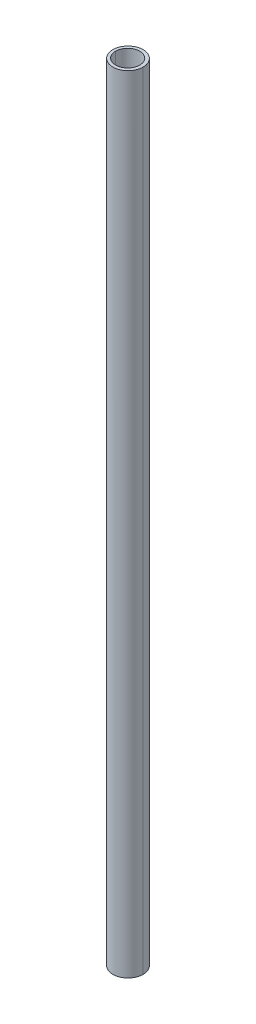
ISO-10303-21;
HEADER;
FILE_DESCRIPTION(('STEP AP214'),'2;1');
FILE_NAME('part.step','',(''),(''),'','','');
FILE_SCHEMA(('AUTOMOTIVE_DESIGN { 1 0 10303 214 1 1 1 1 }'));
ENDSEC;
DATA;
#1=APPLICATION_CONTEXT('core data for automotive mechanical design processes');
#2=APPLICATION_PROTOCOL_DEFINITION('international standard','automotive_design',2000,#1);
#3=PRODUCT_CONTEXT('',#1,'mechanical');
#4=PRODUCT('Part','Part','',(#3));
#5=PRODUCT_RELATED_PRODUCT_CATEGORY('part','',(#4));
#6=PRODUCT_DEFINITION_FORMATION('','',#4);
#7=PRODUCT_DEFINITION_CONTEXT('part definition',#1,'design');
#8=PRODUCT_DEFINITION('design','',#6,#7);
#9=PRODUCT_DEFINITION_SHAPE('','',#8);
#10=(LENGTH_UNIT() NAMED_UNIT(*) SI_UNIT(.MILLI.,.METRE.));
#11=(NAMED_UNIT(*) PLANE_ANGLE_UNIT() SI_UNIT($,.RADIAN.));
#12=(NAMED_UNIT(*) SI_UNIT($,.STERADIAN.) SOLID_ANGLE_UNIT());
#13=UNCERTAINTY_MEASURE_WITH_UNIT(LENGTH_MEASURE(1.E-05),#10,'distance_accuracy_value','');
#14=(GEOMETRIC_REPRESENTATION_CONTEXT(3) GLOBAL_UNCERTAINTY_ASSIGNED_CONTEXT((#13)) GLOBAL_UNIT_ASSIGNED_CONTEXT((#10,
#11,#12)) REPRESENTATION_CONTEXT('',''));
#15=CARTESIAN_POINT('',(0.,0.,0.));
#16=DIRECTION('',(0.,0.,1.));
#17=DIRECTION('',(1.,0.,0.));
#18=AXIS2_PLACEMENT_3D('',#15,#16,#17);
#19=CARTESIAN_POINT('',(-0.011653013068616,-130.,-0.011565059006402));
#20=DIRECTION('',(0.,1.,0.));
#21=DIRECTION('',(-1.,0.,0.));
#22=AXIS2_PLACEMENT_3D('',#19,#20,#21);
#23=PLANE('',#22);
#24=CARTESIAN_POINT('',(-0.011653013068616,-130.,-0.0115650590064179));
#25=DIRECTION('',(0.,1.,0.));
#26=DIRECTION('',(1.,0.,0.));
#27=AXIS2_PLACEMENT_3D('',#24,#25,#26);
#28=CIRCLE('',#27,5.);
#29=CARTESIAN_POINT('',(4.98834698693138,-130.,-0.0115650590064184));
#30=VERTEX_POINT('',#29);
#31=CARTESIAN_POINT('',(-5.01165301306862,-130.,-0.011565059006407));
#32=VERTEX_POINT('',#31);
#33=EDGE_CURVE('E64',#30,#32,#28,.T.);
#34=ORIENTED_EDGE('',*,*,#33,.F.);
#35=CARTESIAN_POINT('',(-0.011653013068616,-130.,-0.0115650590064179));
#36=DIRECTION('',(0.,1.,0.));
#37=DIRECTION('',(-1.,0.,0.));
#38=AXIS2_PLACEMENT_3D('',#35,#36,#37);
#39=CIRCLE('',#38,5.);
#40=EDGE_CURVE('E58',#32,#30,#39,.T.);
#41=ORIENTED_EDGE('',*,*,#40,.F.);
#42=EDGE_LOOP('',(#34,#41));
#43=FACE_BOUND('',#42,.T.);
#44=CARTESIAN_POINT('',(-0.122584693569405,-130.,-0.0115650590064179));
#45=DIRECTION('',(0.,-1.,0.));
#46=DIRECTION('',(1.,0.,0.));
#47=AXIS2_PLACEMENT_3D('',#44,#45,#46);
#48=CIRCLE('',#47,4.);
#49=CARTESIAN_POINT('',(3.8774153064306,-130.,-0.0115650590064181));
#50=VERTEX_POINT('',#49);
#51=CARTESIAN_POINT('',(-4.12258469356941,-130.,-0.011565059006407));
#52=VERTEX_POINT('',#51);
#53=EDGE_CURVE('E129',#50,#52,#48,.T.);
#54=ORIENTED_EDGE('',*,*,#53,.F.);
#55=CARTESIAN_POINT('',(-0.122584693569405,-130.,-0.0115650590064179));
#56=DIRECTION('',(0.,-1.,0.));
#57=DIRECTION('',(-1.,0.,0.));
#58=AXIS2_PLACEMENT_3D('',#55,#56,#57);
#59=CIRCLE('',#58,4.);
#60=EDGE_CURVE('E88',#52,#50,#59,.T.);
#61=ORIENTED_EDGE('',*,*,#60,.F.);
#62=EDGE_LOOP('',(#54,#61));
#63=FACE_BOUND('',#62,.T.);
#64=ADVANCED_FACE('F18',(#43,#63),#23,.F.);
#65=CARTESIAN_POINT('',(-0.011653013068616,130.,-0.011565059006402));
#66=DIRECTION('',(0.,-1.,0.));
#67=DIRECTION('',(1.,0.,0.));
#68=AXIS2_PLACEMENT_3D('',#65,#66,#67);
#69=CYLINDRICAL_SURFACE('',#68,5.);
#70=CARTESIAN_POINT('',(4.98834698693138,130.,-0.011565059006381));
#71=DIRECTION('',(0.,-1.,0.));
#72=VECTOR('',#71,1.);
#73=LINE('',#70,#72);
#74=CARTESIAN_POINT('',(4.98834698693138,130.,-0.0115650590064022));
#75=VERTEX_POINT('',#74);
#76=EDGE_CURVE('E81',#75,#30,#73,.T.);
#77=ORIENTED_EDGE('',*,*,#76,.F.);
#78=CARTESIAN_POINT('',(-5.01165301306862,130.,-0.011565059006402));
#79=CARTESIAN_POINT('',(-5.01165301306862,130.,0.480614136488761));
#80=CARTESIAN_POINT('',(-4.91557941508477,130.,0.963886551074239));
#81=CARTESIAN_POINT('',(-4.81966618800687,130.,1.44635226291753));
#82=CARTESIAN_POINT('',(-4.63105067562505,130.,1.90185210281905));
#83=CARTESIAN_POINT('',(-4.44285600322633,130.,2.35633562893756));
#84=CARTESIAN_POINT('',(-4.16900107458134,130.,2.76628610609161));
#85=CARTESIAN_POINT('',(-3.8957571725812,130.,3.17532189945361));
#86=CARTESIAN_POINT('',(-3.54718691900136,130.,3.52396884692634));
#87=CARTESIAN_POINT('',(-3.19939439731767,130.,3.87183789138307));
#88=CARTESIAN_POINT('',(-2.78950417816663,130.,4.14578300250632));
#89=CARTESIAN_POINT('',(-2.38052850836105,130.,4.41911688576816));
#90=CARTESIAN_POINT('',(-1.92507017489407,130.,4.60783260355003));
#91=CARTESIAN_POINT('',(-1.47062806260246,130.,4.79612725776924));
#92=CARTESIAN_POINT('',(-0.987104623149258,130.,4.89236134300975));
#93=CARTESIAN_POINT('',(-0.504660023891753,130.,4.98838071022238));
#94=CARTESIAN_POINT('',(-0.011653013068616,130.,4.9884349409936));
#95=CARTESIAN_POINT('',(0.480253997764685,130.,4.98848905076482));
#96=CARTESIAN_POINT('',(0.963798597012025,130.,4.89236134300975));
#97=CARTESIAN_POINT('',(1.44626430885683,130.,4.79644811593153));
#98=CARTESIAN_POINT('',(1.90176414875683,130.,4.60783260355003));
#99=CARTESIAN_POINT('',(2.35624767487655,130.,4.4196379311505));
#100=CARTESIAN_POINT('',(2.76619815202939,130.,4.14578300250632));
#101=CARTESIAN_POINT('',(3.17523394539255,130.,3.8725391005054));
#102=CARTESIAN_POINT('',(3.52388089286412,130.,3.52396884692634));
#103=CARTESIAN_POINT('',(3.87174993732204,130.,3.17617632524107));
#104=CARTESIAN_POINT('',(4.14569504844411,130.,2.76628610609161));
#105=CARTESIAN_POINT('',(4.41902893170564,130.,2.35731043628629));
#106=CARTESIAN_POINT('',(4.60774464948781,130.,1.90185210281905));
#107=CARTESIAN_POINT('',(4.79603930370664,130.,1.44740999052883));
#108=CARTESIAN_POINT('',(4.89227338894753,130.,0.963886551074241));
#109=CARTESIAN_POINT('',(4.98834698693138,130.,0.481169471968165));
#110=CARTESIAN_POINT('',(4.98834698693138,130.,-0.0115650590064014));
#111=B_SPLINE_CURVE_WITH_KNOTS('',2,(#78,#79,#80,#81,#82,#83,#84,#85,#86,#87,#88,#89,#90,#91,
#92,#93,#94,#95,#96,#97,#98,#99,#100,#101,#102,#103,#104,#105,#106,#107,#108,#109,#110),
.UNSPECIFIED.,.F.,.F.,(3,2,2,2,2,2,2,2,2,2,2,2,2,2,2,2,3),(0.,0.0625,0.125,0.1875,0.25,0.3125,
0.375,0.4375,0.5,0.5625,0.625,0.6875,0.75,0.8125,0.875,0.9375,1.),.UNSPECIFIED.);
#112=CARTESIAN_POINT('',(-5.01165301306862,130.,-0.0115650590064016));
#113=VERTEX_POINT('',#112);
#114=EDGE_CURVE('E74',#113,#75,#111,.T.);
#115=ORIENTED_EDGE('',*,*,#114,.F.);
#116=CARTESIAN_POINT('',(-5.01165301306862,-130.,-0.0115650590064284));
#117=DIRECTION('',(0.,1.,0.));
#118=VECTOR('',#117,1.);
#119=LINE('',#116,#118);
#120=EDGE_CURVE('E68',#32,#113,#119,.T.);
#121=ORIENTED_EDGE('',*,*,#120,.F.);
#122=ORIENTED_EDGE('',*,*,#40,.T.);
#123=EDGE_LOOP('',(#77,#115,#121,#122));
#124=FACE_BOUND('',#123,.T.);
#125=ADVANCED_FACE('F72',(#124),#69,.T.);
#126=CARTESIAN_POINT('',(-0.011653013068616,130.,-0.011565059006402));
#127=DIRECTION('',(0.,-1.,0.));
#128=DIRECTION('',(1.,0.,0.));
#129=AXIS2_PLACEMENT_3D('',#126,#127,#128);
#130=CYLINDRICAL_SURFACE('',#129,5.);
#131=ORIENTED_EDGE('',*,*,#76,.T.);
#132=ORIENTED_EDGE('',*,*,#33,.T.);
#133=ORIENTED_EDGE('',*,*,#120,.T.);
#134=CARTESIAN_POINT('',(4.98834698693138,130.,-0.0115650590064014));
#135=CARTESIAN_POINT('',(4.98834698693138,130.,-0.50374425450012));
#136=CARTESIAN_POINT('',(4.89227338894753,130.,-0.987016669087044));
#137=CARTESIAN_POINT('',(4.79636016187004,130.,-1.46948238092974));
#138=CARTESIAN_POINT('',(4.60774464948781,130.,-1.92498222083185));
#139=CARTESIAN_POINT('',(4.41954997708846,130.,-2.37946574695149));
#140=CARTESIAN_POINT('',(4.14569504844411,130.,-2.78941622410441));
#141=CARTESIAN_POINT('',(3.8724511464428,130.,-3.19845201746796));
#142=CARTESIAN_POINT('',(3.52388089286412,130.,-3.54709896493914));
#143=CARTESIAN_POINT('',(3.17608837117847,130.,-3.89496800939745));
#144=CARTESIAN_POINT('',(2.76619815202939,130.,-4.16891312051913));
#145=CARTESIAN_POINT('',(2.35722248222187,130.,-4.442247003782));
#146=CARTESIAN_POINT('',(1.90176414875683,130.,-4.63096272156283));
#147=CARTESIAN_POINT('',(1.44732203646283,130.,-4.8192573757828));
#148=CARTESIAN_POINT('',(0.963798597012027,130.,-4.91549146102255));
#149=CARTESIAN_POINT('',(0.481353997753079,130.,-5.01151082823518));
#150=CARTESIAN_POINT('',(-0.0116530130686151,130.,-5.0115650590064));
#151=CARTESIAN_POINT('',(-0.503560023900487,130.,-5.01161916877762));
#152=CARTESIAN_POINT('',(-0.987104623149258,130.,-4.91549146102255));
#153=CARTESIAN_POINT('',(-1.46957033499205,130.,-4.81957823394502));
#154=CARTESIAN_POINT('',(-1.92507017489407,130.,-4.63096272156283));
#155=CARTESIAN_POINT('',(-2.37955370101473,130.,-4.44276804916306));
#156=CARTESIAN_POINT('',(-2.78950417816663,130.,-4.16891312051913));
#157=CARTESIAN_POINT('',(-3.19853997153155,130.,-3.89566921851665));
#158=CARTESIAN_POINT('',(-3.54718691900135,130.,-3.54709896493914));
#159=CARTESIAN_POINT('',(-3.89505596346006,130.,-3.1993064432529));
#160=CARTESIAN_POINT('',(-4.16900107458134,130.,-2.78941622410441));
#161=CARTESIAN_POINT('',(-4.44233495784421,130.,-2.38044055429689));
#162=CARTESIAN_POINT('',(-4.63105067562505,130.,-1.92498222083185));
#163=CARTESIAN_POINT('',(-4.81934532984502,130.,-1.47054010853784));
#164=CARTESIAN_POINT('',(-4.91557941508477,130.,-0.987016669087046));
#165=CARTESIAN_POINT('',(-5.01165301306862,130.,-0.504299589979015));
#166=CARTESIAN_POINT('',(-5.01165301306862,130.,-0.011565059006402));
#167=B_SPLINE_CURVE_WITH_KNOTS('',2,(#134,#135,#136,#137,#138,#139,#140,#141,#142,#143,#144,
#145,#146,#147,#148,#149,#150,#151,#152,#153,#154,#155,#156,#157,#158,#159,#160,#161,#162,#163,
#164,#165,#166),.UNSPECIFIED.,.F.,.F.,(3,2,2,2,2,2,2,2,2,2,2,2,2,2,2,2,3),(0.,0.0625,0.125,
0.1875,0.25,0.3125,0.375,0.4375,0.5,0.5625,0.625,0.6875,0.75,0.8125,0.875,0.9375,1.),.UNSPECIFIED.);
#168=EDGE_CURVE('E122',#75,#113,#167,.T.);
#169=ORIENTED_EDGE('',*,*,#168,.F.);
#170=EDGE_LOOP('',(#131,#132,#133,#169));
#171=FACE_BOUND('',#170,.T.);
#172=ADVANCED_FACE('F85',(#171),#130,.T.);
#173=CARTESIAN_POINT('',(-0.122584693569405,130.,-0.011565059006402));
#174=DIRECTION('',(0.,-1.,0.));
#175=DIRECTION('',(1.,0.,0.));
#176=AXIS2_PLACEMENT_3D('',#173,#174,#175);
#177=CYLINDRICAL_SURFACE('',#176,4.);
#178=CARTESIAN_POINT('',(3.8774153064306,130.,-0.0115650590063852));
#179=DIRECTION('',(0.,-1.,0.));
#180=VECTOR('',#179,1.);
#181=LINE('',#178,#180);
#182=CARTESIAN_POINT('',(3.8774153064306,130.,-0.0115650590064025));
#183=VERTEX_POINT('',#182);
#184=EDGE_CURVE('E38',#183,#50,#181,.T.);
#185=ORIENTED_EDGE('',*,*,#184,.F.);
#186=CARTESIAN_POINT('',(-4.12258469356941,130.,-0.011565059006402));
#187=CARTESIAN_POINT('',(-4.12258469356941,130.,-0.806928552906533));
#188=CARTESIAN_POINT('',(-3.81810282361455,130.,-1.54229878846676));
#189=CARTESIAN_POINT('',(-3.5139324395182,130.,-2.27691673808901));
#190=CARTESIAN_POINT('',(-2.9510118183156,130.,-2.83999218375259));
#191=CARTESIAN_POINT('',(-2.3888689076145,130.,-3.40228970501487));
#192=CARTESIAN_POINT('',(-1.65331842302977,130.,-3.70708318905155));
#193=CARTESIAN_POINT('',(-0.918784148038959,130.,-4.01145558158039));
#194=CARTESIAN_POINT('',(-0.122584693569405,130.,-4.0115650590064));
#195=CARTESIAN_POINT('',(0.672514760912545,130.,-4.01167438518241));
#196=CARTESIAN_POINT('',(1.40814903589095,130.,-3.70708318905155));
#197=CARTESIAN_POINT('',(2.14276698551485,130.,-3.40291280495449));
#198=CARTESIAN_POINT('',(2.70584243117678,130.,-2.83999218375259));
#199=CARTESIAN_POINT('',(3.26813995243972,130.,-2.27784927304989));
#200=CARTESIAN_POINT('',(3.57293343647574,130.,-1.54229878846676));
#201=CARTESIAN_POINT('',(3.87741530643059,130.,-0.807500314344509));
#202=CARTESIAN_POINT('',(3.87741530643059,130.,-0.0115650590064025));
#203=B_SPLINE_CURVE_WITH_KNOTS('',2,(#186,#187,#188,#189,#190,#191,#192,#193,#194,#195,#196,
#197,#198,#199,#200,#201,#202),.UNSPECIFIED.,.F.,.F.,(3,2,2,2,2,2,2,2,3),(0.,0.125,0.25,0.375,
0.5,0.625,0.75,0.875,1.),.UNSPECIFIED.);
#204=CARTESIAN_POINT('',(-4.12258469356941,130.,-0.0115650590064017));
#205=VERTEX_POINT('',#204);
#206=EDGE_CURVE('E30',#205,#183,#203,.T.);
#207=ORIENTED_EDGE('',*,*,#206,.F.);
#208=CARTESIAN_POINT('',(-4.12258469356941,-130.,-0.0115650590064263));
#209=DIRECTION('',(0.,1.,0.));
#210=VECTOR('',#209,1.);
#211=LINE('',#208,#210);
#212=EDGE_CURVE('E175',#52,#205,#211,.T.);
#213=ORIENTED_EDGE('',*,*,#212,.F.);
#214=ORIENTED_EDGE('',*,*,#60,.T.);
#215=EDGE_LOOP('',(#185,#207,#213,#214));
#216=FACE_BOUND('',#215,.T.);
#217=ADVANCED_FACE('F103',(#216),#177,.F.);
#218=CARTESIAN_POINT('',(-0.122584693569405,130.,-0.011565059006402));
#219=DIRECTION('',(0.,-1.,0.));
#220=DIRECTION('',(1.,0.,0.));
#221=AXIS2_PLACEMENT_3D('',#218,#219,#220);
#222=CYLINDRICAL_SURFACE('',#221,4.);
#223=ORIENTED_EDGE('',*,*,#184,.T.);
#224=ORIENTED_EDGE('',*,*,#53,.T.);
#225=ORIENTED_EDGE('',*,*,#212,.T.);
#226=CARTESIAN_POINT('',(3.87741530643059,130.,-0.0115650590064025));
#227=CARTESIAN_POINT('',(3.87741530643059,130.,0.783798434893784));
#228=CARTESIAN_POINT('',(3.57293343647574,130.,1.51916867045396));
#229=CARTESIAN_POINT('',(3.26876305237913,130.,2.25378662007678));
#230=CARTESIAN_POINT('',(2.70584243117678,130.,2.81686206573979));
#231=CARTESIAN_POINT('',(2.14369952047516,130.,3.37915958700228));
#232=CARTESIAN_POINT('',(1.40814903589096,130.,3.68395307103874));
#233=CARTESIAN_POINT('',(0.673614760900149,130.,3.98832546356759));
#234=CARTESIAN_POINT('',(-0.122584693569404,130.,3.9884349409936));
#235=CARTESIAN_POINT('',(-0.917684148051512,130.,3.98854426716961));
#236=CARTESIAN_POINT('',(-1.65331842302977,130.,3.68395307103874));
#237=CARTESIAN_POINT('',(-2.38793637265323,130.,3.3797826869418));
#238=CARTESIAN_POINT('',(-2.9510118183156,130.,2.81686206573979));
#239=CARTESIAN_POINT('',(-3.51330933957832,130.,2.25471915503762));
#240=CARTESIAN_POINT('',(-3.81810282361455,130.,1.51916867045396));
#241=CARTESIAN_POINT('',(-4.12258469356941,130.,0.784370196331704));
#242=CARTESIAN_POINT('',(-4.12258469356941,130.,-0.011565059006402));
#243=B_SPLINE_CURVE_WITH_KNOTS('',2,(#226,#227,#228,#229,#230,#231,#232,#233,#234,#235,#236,
#237,#238,#239,#240,#241,#242),.UNSPECIFIED.,.F.,.F.,(3,2,2,2,2,2,2,2,3),(0.,0.125,0.25,0.375,
0.5,0.625,0.75,0.875,1.),.UNSPECIFIED.);
#244=EDGE_CURVE('E11',#183,#205,#243,.T.);
#245=ORIENTED_EDGE('',*,*,#244,.F.);
#246=EDGE_LOOP('',(#223,#224,#225,#245));
#247=FACE_BOUND('',#246,.T.);
#248=ADVANCED_FACE('F142',(#247),#222,.F.);
#249=CARTESIAN_POINT('',(-0.011653013068616,130.,-0.011565059006402));
#250=DIRECTION('',(0.,1.,0.));
#251=DIRECTION('',(-1.,0.,0.));
#252=AXIS2_PLACEMENT_3D('',#249,#250,#251);
#253=PLANE('',#252);
#254=ORIENTED_EDGE('',*,*,#206,.T.);
#255=ORIENTED_EDGE('',*,*,#244,.T.);
#256=EDGE_LOOP('',(#254,#255));
#257=FACE_BOUND('',#256,.T.);
#258=ORIENTED_EDGE('',*,*,#114,.T.);
#259=ORIENTED_EDGE('',*,*,#168,.T.);
#260=EDGE_LOOP('',(#258,#259));
#261=FACE_BOUND('',#260,.T.);
#262=ADVANCED_FACE('F127',(#257,#261),#253,.T.);
#263=CLOSED_SHELL('',(#64,#125,#172,#217,#248,#262));
#264=MANIFOLD_SOLID_BREP('B1',#263);
#265=ADVANCED_BREP_SHAPE_REPRESENTATION('',(#18,#264),#14);
#266=SHAPE_DEFINITION_REPRESENTATION(#9,#265);
ENDSEC;
END-ISO-10303-21;
